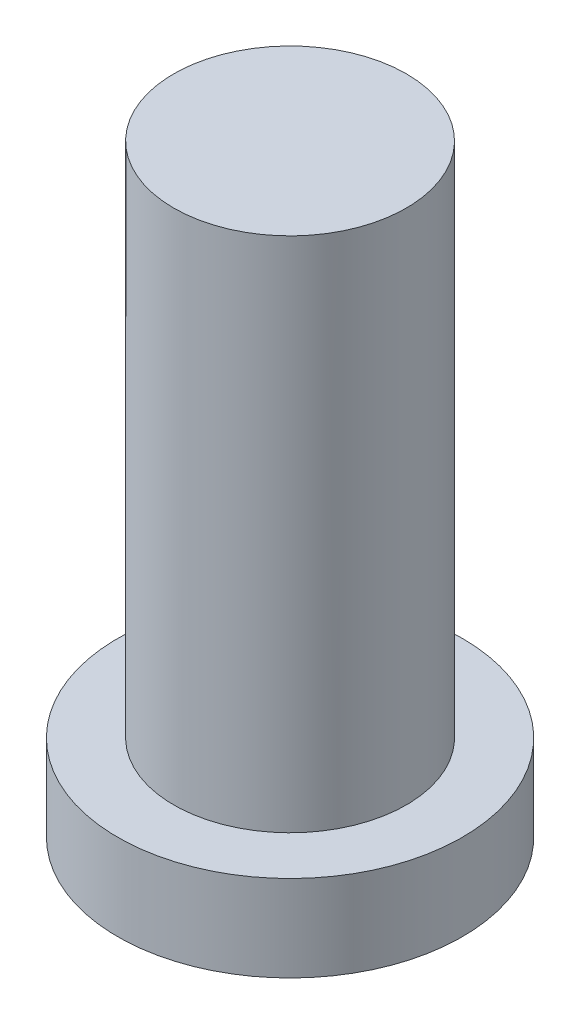
ISO-10303-21;
HEADER;
FILE_DESCRIPTION(('STEP AP214'),'2;1');
FILE_NAME('part.step','',(''),(''),'','','');
FILE_SCHEMA(('AUTOMOTIVE_DESIGN { 1 0 10303 214 1 1 1 1 }'));
ENDSEC;
DATA;
#1=APPLICATION_CONTEXT('core data for automotive mechanical design processes');
#2=APPLICATION_PROTOCOL_DEFINITION('international standard','automotive_design',2000,#1);
#3=PRODUCT_CONTEXT('',#1,'mechanical');
#4=PRODUCT('Part','Part','',(#3));
#5=PRODUCT_RELATED_PRODUCT_CATEGORY('part','',(#4));
#6=PRODUCT_DEFINITION_FORMATION('','',#4);
#7=PRODUCT_DEFINITION_CONTEXT('part definition',#1,'design');
#8=PRODUCT_DEFINITION('design','',#6,#7);
#9=PRODUCT_DEFINITION_SHAPE('','',#8);
#10=(LENGTH_UNIT() NAMED_UNIT(*) SI_UNIT(.MILLI.,.METRE.));
#11=(NAMED_UNIT(*) PLANE_ANGLE_UNIT() SI_UNIT($,.RADIAN.));
#12=(NAMED_UNIT(*) SI_UNIT($,.STERADIAN.) SOLID_ANGLE_UNIT());
#13=UNCERTAINTY_MEASURE_WITH_UNIT(LENGTH_MEASURE(1.E-05),#10,'distance_accuracy_value','');
#14=(GEOMETRIC_REPRESENTATION_CONTEXT(3) GLOBAL_UNCERTAINTY_ASSIGNED_CONTEXT((#13)) GLOBAL_UNIT_ASSIGNED_CONTEXT((#10,
#11,#12)) REPRESENTATION_CONTEXT('',''));
#15=CARTESIAN_POINT('',(0.,0.,0.));
#16=DIRECTION('',(0.,0.,1.));
#17=DIRECTION('',(1.,0.,0.));
#18=AXIS2_PLACEMENT_3D('',#15,#16,#17);
#19=CARTESIAN_POINT('',(0.,6.,0.));
#20=DIRECTION('',(0.,-1.,0.));
#21=DIRECTION('',(0.,0.,-1.));
#22=AXIS2_PLACEMENT_3D('',#19,#20,#21);
#23=CYLINDRICAL_SURFACE('',#22,1.35);
#24=CARTESIAN_POINT('',(0.,6.,0.));
#25=DIRECTION('',(0.,1.,0.));
#26=DIRECTION('',(0.,0.,1.));
#27=AXIS2_PLACEMENT_3D('',#24,#25,#26);
#28=CIRCLE('',#27,1.35);
#29=CARTESIAN_POINT('',(0.,6.,1.35));
#30=VERTEX_POINT('',#29);
#31=EDGE_CURVE('E10',#30,#30,#28,.T.);
#32=ORIENTED_EDGE('',*,*,#31,.F.);
#33=EDGE_LOOP('',(#32));
#34=FACE_BOUND('',#33,.T.);
#35=CARTESIAN_POINT('',(0.,0.,0.));
#36=DIRECTION('',(0.,-1.,0.));
#37=DIRECTION('',(0.,0.,-1.));
#38=AXIS2_PLACEMENT_3D('',#35,#36,#37);
#39=CIRCLE('',#38,1.35);
#40=CARTESIAN_POINT('',(0.,0.,-1.35));
#41=VERTEX_POINT('',#40);
#42=EDGE_CURVE('E37',#41,#41,#39,.T.);
#43=ORIENTED_EDGE('',*,*,#42,.F.);
#44=EDGE_LOOP('',(#43));
#45=FACE_BOUND('',#44,.T.);
#46=ADVANCED_FACE('F31',(#34,#45),#23,.T.);
#47=CARTESIAN_POINT('',(0.,6.,0.));
#48=DIRECTION('',(0.,1.,0.));
#49=DIRECTION('',(0.,0.,1.));
#50=AXIS2_PLACEMENT_3D('',#47,#48,#49);
#51=PLANE('',#50);
#52=ORIENTED_EDGE('',*,*,#31,.T.);
#53=EDGE_LOOP('',(#52));
#54=FACE_BOUND('',#53,.T.);
#55=ADVANCED_FACE('F64',(#54),#51,.T.);
#56=CARTESIAN_POINT('',(0.,-1.,0.));
#57=DIRECTION('',(0.,1.,0.));
#58=DIRECTION('',(0.,0.,1.));
#59=AXIS2_PLACEMENT_3D('',#56,#57,#58);
#60=CYLINDRICAL_SURFACE('',#59,2.);
#61=CARTESIAN_POINT('',(0.,-1.,0.));
#62=DIRECTION('',(0.,-1.,0.));
#63=DIRECTION('',(0.,0.,-1.));
#64=AXIS2_PLACEMENT_3D('',#61,#62,#63);
#65=CIRCLE('',#64,2.);
#66=CARTESIAN_POINT('',(0.,-1.,-2.));
#67=VERTEX_POINT('',#66);
#68=EDGE_CURVE('E41',#67,#67,#65,.T.);
#69=ORIENTED_EDGE('',*,*,#68,.F.);
#70=EDGE_LOOP('',(#69));
#71=FACE_BOUND('',#70,.T.);
#72=CARTESIAN_POINT('',(0.,0.,0.));
#73=DIRECTION('',(0.,-1.,0.));
#74=DIRECTION('',(0.,0.,-1.));
#75=AXIS2_PLACEMENT_3D('',#72,#73,#74);
#76=CIRCLE('',#75,2.);
#77=CARTESIAN_POINT('',(0.,0.,-2.));
#78=VERTEX_POINT('',#77);
#79=EDGE_CURVE('E45',#78,#78,#76,.T.);
#80=ORIENTED_EDGE('',*,*,#79,.T.);
#81=EDGE_LOOP('',(#80));
#82=FACE_BOUND('',#81,.T.);
#83=ADVANCED_FACE('F51',(#71,#82),#60,.T.);
#84=CARTESIAN_POINT('',(0.,-1.,0.));
#85=DIRECTION('',(0.,-1.,0.));
#86=DIRECTION('',(0.,0.,-1.));
#87=AXIS2_PLACEMENT_3D('',#84,#85,#86);
#88=PLANE('',#87);
#89=ORIENTED_EDGE('',*,*,#68,.T.);
#90=EDGE_LOOP('',(#89));
#91=FACE_BOUND('',#90,.T.);
#92=ADVANCED_FACE('F55',(#91),#88,.T.);
#93=CARTESIAN_POINT('',(0.,0.,0.));
#94=DIRECTION('',(0.,-1.,0.));
#95=DIRECTION('',(0.,0.,-1.));
#96=AXIS2_PLACEMENT_3D('',#93,#94,#95);
#97=PLANE('',#96);
#98=ORIENTED_EDGE('',*,*,#42,.T.);
#99=EDGE_LOOP('',(#98));
#100=FACE_BOUND('',#99,.T.);
#101=ORIENTED_EDGE('',*,*,#79,.F.);
#102=EDGE_LOOP('',(#101));
#103=FACE_BOUND('',#102,.T.);
#104=ADVANCED_FACE('F53',(#100,#103),#97,.F.);
#105=CLOSED_SHELL('',(#46,#55,#83,#92,#104));
#106=MANIFOLD_SOLID_BREP('B2',#105);
#107=ADVANCED_BREP_SHAPE_REPRESENTATION('',(#18,#106),#14);
#108=SHAPE_DEFINITION_REPRESENTATION(#9,#107);
ENDSEC;
END-ISO-10303-21;
